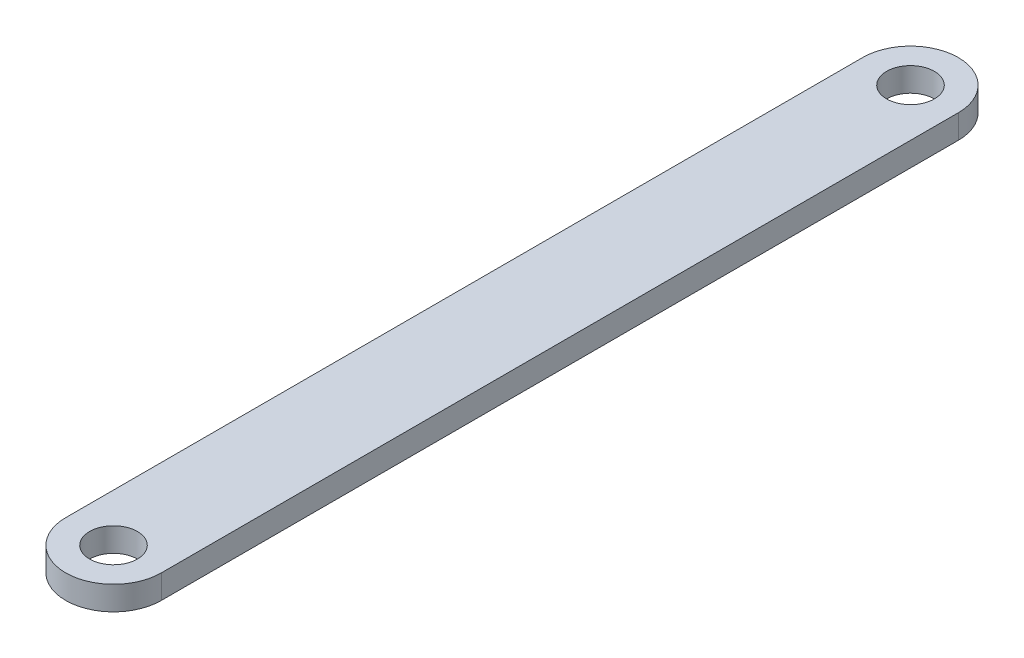
ISO-10303-21;
HEADER;
FILE_DESCRIPTION(('STEP AP214'),'2;1');
FILE_NAME('part.step','',(''),(''),'','','');
FILE_SCHEMA(('AUTOMOTIVE_DESIGN { 1 0 10303 214 1 1 1 1 }'));
ENDSEC;
DATA;
#1=APPLICATION_CONTEXT('core data for automotive mechanical design processes');
#2=APPLICATION_PROTOCOL_DEFINITION('international standard','automotive_design',2000,#1);
#3=PRODUCT_CONTEXT('',#1,'mechanical');
#4=PRODUCT('Part','Part','',(#3));
#5=PRODUCT_RELATED_PRODUCT_CATEGORY('part','',(#4));
#6=PRODUCT_DEFINITION_FORMATION('','',#4);
#7=PRODUCT_DEFINITION_CONTEXT('part definition',#1,'design');
#8=PRODUCT_DEFINITION('design','',#6,#7);
#9=PRODUCT_DEFINITION_SHAPE('','',#8);
#10=(LENGTH_UNIT() NAMED_UNIT(*) SI_UNIT(.MILLI.,.METRE.));
#11=(NAMED_UNIT(*) PLANE_ANGLE_UNIT() SI_UNIT($,.RADIAN.));
#12=(NAMED_UNIT(*) SI_UNIT($,.STERADIAN.) SOLID_ANGLE_UNIT());
#13=UNCERTAINTY_MEASURE_WITH_UNIT(LENGTH_MEASURE(1.E-05),#10,'distance_accuracy_value','');
#14=(GEOMETRIC_REPRESENTATION_CONTEXT(3) GLOBAL_UNCERTAINTY_ASSIGNED_CONTEXT((#13)) GLOBAL_UNIT_ASSIGNED_CONTEXT((#10,
#11,#12)) REPRESENTATION_CONTEXT('',''));
#15=CARTESIAN_POINT('',(0.,0.,0.));
#16=DIRECTION('',(0.,0.,1.));
#17=DIRECTION('',(1.,0.,0.));
#18=AXIS2_PLACEMENT_3D('',#15,#16,#17);
#19=CARTESIAN_POINT('',(3.,1.5,0.));
#20=DIRECTION('',(0.,1.,0.));
#21=DIRECTION('',(0.,0.,1.));
#22=AXIS2_PLACEMENT_3D('',#19,#20,#21);
#23=PLANE('',#22);
#24=CARTESIAN_POINT('',(3.,1.5,0.));
#25=DIRECTION('',(0.,1.,0.));
#26=DIRECTION('',(0.,0.,1.));
#27=AXIS2_PLACEMENT_3D('',#24,#25,#26);
#28=CIRCLE('',#27,1.5);
#29=CARTESIAN_POINT('',(3.,1.5,1.5));
#30=VERTEX_POINT('',#29);
#31=EDGE_CURVE('E116',#30,#30,#28,.T.);
#32=ORIENTED_EDGE('',*,*,#31,.F.);
#33=EDGE_LOOP('',(#32));
#34=FACE_BOUND('',#33,.T.);
#35=CARTESIAN_POINT('',(3.,1.5,0.));
#36=DIRECTION('',(0.,1.,0.));
#37=DIRECTION('',(0.,0.,1.));
#38=AXIS2_PLACEMENT_3D('',#35,#36,#37);
#39=CIRCLE('',#38,3.);
#40=CARTESIAN_POINT('',(6.,1.5,0.));
#41=VERTEX_POINT('',#40);
#42=CARTESIAN_POINT('',(0.,1.5,0.));
#43=VERTEX_POINT('',#42);
#44=EDGE_CURVE('E96',#41,#43,#39,.T.);
#45=ORIENTED_EDGE('',*,*,#44,.T.);
#46=DIRECTION('',(0.,0.,1.));
#47=VECTOR('',#46,1.);
#48=CARTESIAN_POINT('',(0.,1.5,0.));
#49=LINE('',#48,#47);
#50=CARTESIAN_POINT('',(0.,1.5,50.));
#51=VERTEX_POINT('',#50);
#52=EDGE_CURVE('E91',#43,#51,#49,.T.);
#53=ORIENTED_EDGE('',*,*,#52,.T.);
#54=CARTESIAN_POINT('',(3.00000000000001,1.5,50.));
#55=DIRECTION('',(0.,1.,0.));
#56=DIRECTION('',(0.,0.,1.));
#57=AXIS2_PLACEMENT_3D('',#54,#55,#56);
#58=CIRCLE('',#57,3.);
#59=CARTESIAN_POINT('',(6.00000000000001,1.5,50.));
#60=VERTEX_POINT('',#59);
#61=EDGE_CURVE('E94',#51,#60,#58,.T.);
#62=ORIENTED_EDGE('',*,*,#61,.T.);
#63=DIRECTION('',(0.,0.,-1.));
#64=VECTOR('',#63,1.);
#65=CARTESIAN_POINT('',(6.,1.5,0.));
#66=LINE('',#65,#64);
#67=EDGE_CURVE('E61',#60,#41,#66,.T.);
#68=ORIENTED_EDGE('',*,*,#67,.T.);
#69=EDGE_LOOP('',(#45,#53,#62,#68));
#70=FACE_BOUND('',#69,.T.);
#71=CARTESIAN_POINT('',(3.00000000000001,1.5,50.));
#72=DIRECTION('',(0.,1.,0.));
#73=DIRECTION('',(0.,0.,1.));
#74=AXIS2_PLACEMENT_3D('',#71,#72,#73);
#75=CIRCLE('',#74,1.5);
#76=CARTESIAN_POINT('',(3.00000000000001,1.5,51.5));
#77=VERTEX_POINT('',#76);
#78=EDGE_CURVE('E138',#77,#77,#75,.T.);
#79=ORIENTED_EDGE('',*,*,#78,.F.);
#80=EDGE_LOOP('',(#79));
#81=FACE_BOUND('',#80,.T.);
#82=ADVANCED_FACE('F43',(#34,#70,#81),#23,.T.);
#83=CARTESIAN_POINT('',(3.,0.,0.));
#84=DIRECTION('',(0.,1.,0.));
#85=DIRECTION('',(0.,0.,1.));
#86=AXIS2_PLACEMENT_3D('',#83,#84,#85);
#87=PLANE('',#86);
#88=CARTESIAN_POINT('',(3.,0.,0.));
#89=DIRECTION('',(0.,1.,0.));
#90=DIRECTION('',(0.,0.,1.));
#91=AXIS2_PLACEMENT_3D('',#88,#89,#90);
#92=CIRCLE('',#91,3.);
#93=CARTESIAN_POINT('',(6.,0.,0.));
#94=VERTEX_POINT('',#93);
#95=CARTESIAN_POINT('',(0.,0.,0.));
#96=VERTEX_POINT('',#95);
#97=EDGE_CURVE('E112',#94,#96,#92,.T.);
#98=ORIENTED_EDGE('',*,*,#97,.F.);
#99=DIRECTION('',(0.,0.,-1.));
#100=VECTOR('',#99,1.);
#101=CARTESIAN_POINT('',(6.,0.,0.));
#102=LINE('',#101,#100);
#103=CARTESIAN_POINT('',(6.00000000000001,0.,50.));
#104=VERTEX_POINT('',#103);
#105=EDGE_CURVE('E84',#104,#94,#102,.T.);
#106=ORIENTED_EDGE('',*,*,#105,.F.);
#107=CARTESIAN_POINT('',(3.00000000000001,0.,50.));
#108=DIRECTION('',(0.,1.,0.));
#109=DIRECTION('',(0.,0.,1.));
#110=AXIS2_PLACEMENT_3D('',#107,#108,#109);
#111=CIRCLE('',#110,3.);
#112=CARTESIAN_POINT('',(0.,0.,50.));
#113=VERTEX_POINT('',#112);
#114=EDGE_CURVE('E78',#113,#104,#111,.T.);
#115=ORIENTED_EDGE('',*,*,#114,.F.);
#116=DIRECTION('',(0.,0.,1.));
#117=VECTOR('',#116,1.);
#118=CARTESIAN_POINT('',(0.,0.,0.));
#119=LINE('',#118,#117);
#120=EDGE_CURVE('E101',#96,#113,#119,.T.);
#121=ORIENTED_EDGE('',*,*,#120,.F.);
#122=EDGE_LOOP('',(#98,#106,#115,#121));
#123=FACE_BOUND('',#122,.T.);
#124=CARTESIAN_POINT('',(3.,0.,0.));
#125=DIRECTION('',(0.,1.,0.));
#126=DIRECTION('',(0.,0.,1.));
#127=AXIS2_PLACEMENT_3D('',#124,#125,#126);
#128=CIRCLE('',#127,1.5);
#129=CARTESIAN_POINT('',(3.,0.,1.5));
#130=VERTEX_POINT('',#129);
#131=EDGE_CURVE('E134',#130,#130,#128,.T.);
#132=ORIENTED_EDGE('',*,*,#131,.T.);
#133=EDGE_LOOP('',(#132));
#134=FACE_BOUND('',#133,.T.);
#135=CARTESIAN_POINT('',(3.00000000000001,0.,50.));
#136=DIRECTION('',(0.,1.,0.));
#137=DIRECTION('',(0.,0.,1.));
#138=AXIS2_PLACEMENT_3D('',#135,#136,#137);
#139=CIRCLE('',#138,1.5);
#140=CARTESIAN_POINT('',(3.00000000000001,0.,51.5));
#141=VERTEX_POINT('',#140);
#142=EDGE_CURVE('E142',#141,#141,#139,.T.);
#143=ORIENTED_EDGE('',*,*,#142,.T.);
#144=EDGE_LOOP('',(#143));
#145=FACE_BOUND('',#144,.T.);
#146=ADVANCED_FACE('F129',(#123,#134,#145),#87,.F.);
#147=CARTESIAN_POINT('',(3.,1.5,0.));
#148=DIRECTION('',(0.,-1.,0.));
#149=DIRECTION('',(0.,0.,-1.));
#150=AXIS2_PLACEMENT_3D('',#147,#148,#149);
#151=CYLINDRICAL_SURFACE('',#150,3.);
#152=ORIENTED_EDGE('',*,*,#97,.T.);
#153=DIRECTION('',(0.,-1.,0.));
#154=VECTOR('',#153,1.);
#155=CARTESIAN_POINT('',(0.,1.5,0.));
#156=LINE('',#155,#154);
#157=EDGE_CURVE('E11',#43,#96,#156,.T.);
#158=ORIENTED_EDGE('',*,*,#157,.F.);
#159=ORIENTED_EDGE('',*,*,#44,.F.);
#160=DIRECTION('',(0.,-1.,0.));
#161=VECTOR('',#160,1.);
#162=CARTESIAN_POINT('',(6.,1.5,0.));
#163=LINE('',#162,#161);
#164=EDGE_CURVE('E108',#41,#94,#163,.T.);
#165=ORIENTED_EDGE('',*,*,#164,.T.);
#166=EDGE_LOOP('',(#152,#158,#159,#165));
#167=FACE_BOUND('',#166,.T.);
#168=ADVANCED_FACE('F45',(#167),#151,.T.);
#169=CARTESIAN_POINT('',(0.,1.5,0.));
#170=DIRECTION('',(1.,0.,0.));
#171=DIRECTION('',(0.,0.,-1.));
#172=AXIS2_PLACEMENT_3D('',#169,#170,#171);
#173=PLANE('',#172);
#174=ORIENTED_EDGE('',*,*,#120,.T.);
#175=DIRECTION('',(0.,-1.,0.));
#176=VECTOR('',#175,1.);
#177=CARTESIAN_POINT('',(0.,1.5,50.));
#178=LINE('',#177,#176);
#179=EDGE_CURVE('E53',#51,#113,#178,.T.);
#180=ORIENTED_EDGE('',*,*,#179,.F.);
#181=ORIENTED_EDGE('',*,*,#52,.F.);
#182=ORIENTED_EDGE('',*,*,#157,.T.);
#183=EDGE_LOOP('',(#174,#180,#181,#182));
#184=FACE_BOUND('',#183,.T.);
#185=ADVANCED_FACE('F100',(#184),#173,.F.);
#186=CARTESIAN_POINT('',(3.00000000000001,1.5,50.));
#187=DIRECTION('',(0.,-1.,0.));
#188=DIRECTION('',(0.,0.,-1.));
#189=AXIS2_PLACEMENT_3D('',#186,#187,#188);
#190=CYLINDRICAL_SURFACE('',#189,3.);
#191=ORIENTED_EDGE('',*,*,#114,.T.);
#192=DIRECTION('',(0.,-1.,0.));
#193=VECTOR('',#192,1.);
#194=CARTESIAN_POINT('',(6.00000000000001,1.5,50.));
#195=LINE('',#194,#193);
#196=EDGE_CURVE('E103',#60,#104,#195,.T.);
#197=ORIENTED_EDGE('',*,*,#196,.F.);
#198=ORIENTED_EDGE('',*,*,#61,.F.);
#199=ORIENTED_EDGE('',*,*,#179,.T.);
#200=EDGE_LOOP('',(#191,#197,#198,#199));
#201=FACE_BOUND('',#200,.T.);
#202=ADVANCED_FACE('F104',(#201),#190,.T.);
#203=CARTESIAN_POINT('',(6.,1.5,0.));
#204=DIRECTION('',(-1.,0.,0.));
#205=DIRECTION('',(0.,0.,1.));
#206=AXIS2_PLACEMENT_3D('',#203,#204,#205);
#207=PLANE('',#206);
#208=ORIENTED_EDGE('',*,*,#105,.T.);
#209=ORIENTED_EDGE('',*,*,#164,.F.);
#210=ORIENTED_EDGE('',*,*,#67,.F.);
#211=ORIENTED_EDGE('',*,*,#196,.T.);
#212=EDGE_LOOP('',(#208,#209,#210,#211));
#213=FACE_BOUND('',#212,.T.);
#214=ADVANCED_FACE('F126',(#213),#207,.F.);
#215=CARTESIAN_POINT('',(3.,1.5,0.));
#216=DIRECTION('',(0.,-1.,0.));
#217=DIRECTION('',(0.,0.,-1.));
#218=AXIS2_PLACEMENT_3D('',#215,#216,#217);
#219=CYLINDRICAL_SURFACE('',#218,1.5);
#220=ORIENTED_EDGE('',*,*,#31,.T.);
#221=EDGE_LOOP('',(#220));
#222=FACE_BOUND('',#221,.T.);
#223=ORIENTED_EDGE('',*,*,#131,.F.);
#224=EDGE_LOOP('',(#223));
#225=FACE_BOUND('',#224,.T.);
#226=ADVANCED_FACE('F161',(#222,#225),#219,.F.);
#227=CARTESIAN_POINT('',(3.00000000000001,1.5,50.));
#228=DIRECTION('',(0.,-1.,0.));
#229=DIRECTION('',(0.,0.,-1.));
#230=AXIS2_PLACEMENT_3D('',#227,#228,#229);
#231=CYLINDRICAL_SURFACE('',#230,1.5);
#232=ORIENTED_EDGE('',*,*,#78,.T.);
#233=EDGE_LOOP('',(#232));
#234=FACE_BOUND('',#233,.T.);
#235=ORIENTED_EDGE('',*,*,#142,.F.);
#236=EDGE_LOOP('',(#235));
#237=FACE_BOUND('',#236,.T.);
#238=ADVANCED_FACE('F150',(#234,#237),#231,.F.);
#239=CLOSED_SHELL('',(#82,#146,#168,#185,#202,#214,#226,#238));
#240=MANIFOLD_SOLID_BREP('B2',#239);
#241=ADVANCED_BREP_SHAPE_REPRESENTATION('',(#18,#240),#14);
#242=SHAPE_DEFINITION_REPRESENTATION(#9,#241);
ENDSEC;
END-ISO-10303-21;
